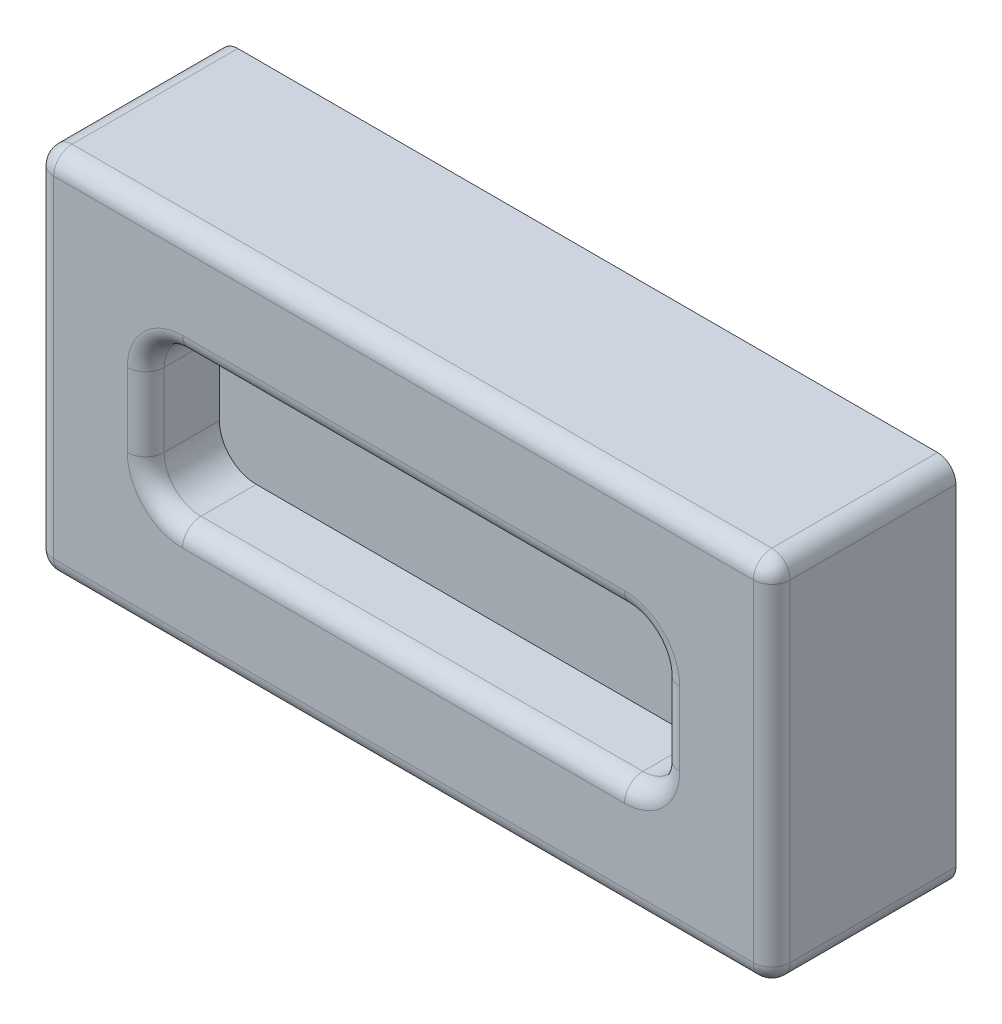
ISO-10303-21;
HEADER;
FILE_DESCRIPTION(('STEP AP214'),'2;1');
FILE_NAME('part.step','',(''),(''),'','','');
FILE_SCHEMA(('AUTOMOTIVE_DESIGN { 1 0 10303 214 1 1 1 1 }'));
ENDSEC;
DATA;
#1=APPLICATION_CONTEXT('core data for automotive mechanical design processes');
#2=APPLICATION_PROTOCOL_DEFINITION('international standard','automotive_design',2000,#1);
#3=PRODUCT_CONTEXT('',#1,'mechanical');
#4=PRODUCT('Part','Part','',(#3));
#5=PRODUCT_RELATED_PRODUCT_CATEGORY('part','',(#4));
#6=PRODUCT_DEFINITION_FORMATION('','',#4);
#7=PRODUCT_DEFINITION_CONTEXT('part definition',#1,'design');
#8=PRODUCT_DEFINITION('design','',#6,#7);
#9=PRODUCT_DEFINITION_SHAPE('','',#8);
#10=(LENGTH_UNIT() NAMED_UNIT(*) SI_UNIT(.MILLI.,.METRE.));
#11=(NAMED_UNIT(*) PLANE_ANGLE_UNIT() SI_UNIT($,.RADIAN.));
#12=(NAMED_UNIT(*) SI_UNIT($,.STERADIAN.) SOLID_ANGLE_UNIT());
#13=UNCERTAINTY_MEASURE_WITH_UNIT(LENGTH_MEASURE(1.E-05),#10,'distance_accuracy_value','');
#14=(GEOMETRIC_REPRESENTATION_CONTEXT(3) GLOBAL_UNCERTAINTY_ASSIGNED_CONTEXT((#13)) GLOBAL_UNIT_ASSIGNED_CONTEXT((#10,
#11,#12)) REPRESENTATION_CONTEXT('',''));
#15=CARTESIAN_POINT('',(0.,0.,0.));
#16=DIRECTION('',(0.,0.,1.));
#17=DIRECTION('',(1.,0.,0.));
#18=AXIS2_PLACEMENT_3D('',#15,#16,#17);
#19=CARTESIAN_POINT('',(0.,0.,5.));
#20=DIRECTION('',(1.,0.,0.));
#21=DIRECTION('',(0.,0.,-1.));
#22=AXIS2_PLACEMENT_3D('',#19,#20,#21);
#23=PLANE('',#22);
#24=DIRECTION('',(0.,-1.,0.));
#25=VECTOR('',#24,1.);
#26=CARTESIAN_POINT('',(0.,0.,0.));
#27=LINE('',#26,#25);
#28=CARTESIAN_POINT('',(0.,9.5,0.));
#29=VERTEX_POINT('',#28);
#30=CARTESIAN_POINT('',(0.,0.5,0.));
#31=VERTEX_POINT('',#30);
#32=EDGE_CURVE('E250',#29,#31,#27,.T.);
#33=ORIENTED_EDGE('',*,*,#32,.T.);
#34=DIRECTION('',(0.,0.,-1.));
#35=VECTOR('',#34,1.);
#36=CARTESIAN_POINT('',(0.,0.5,5.));
#37=LINE('',#36,#35);
#38=CARTESIAN_POINT('',(0.,0.5,4.5));
#39=VERTEX_POINT('',#38);
#40=EDGE_CURVE('E444',#31,#39,#37,.F.);
#41=ORIENTED_EDGE('',*,*,#40,.T.);
#42=DIRECTION('',(0.,-1.,0.));
#43=VECTOR('',#42,1.);
#44=CARTESIAN_POINT('',(0.,0.,4.5));
#45=LINE('',#44,#43);
#46=CARTESIAN_POINT('',(0.,9.5,4.5));
#47=VERTEX_POINT('',#46);
#48=EDGE_CURVE('E386',#39,#47,#45,.F.);
#49=ORIENTED_EDGE('',*,*,#48,.T.);
#50=DIRECTION('',(0.,0.,-1.));
#51=VECTOR('',#50,1.);
#52=CARTESIAN_POINT('',(0.,9.5,5.));
#53=LINE('',#52,#51);
#54=EDGE_CURVE('E418',#47,#29,#53,.T.);
#55=ORIENTED_EDGE('',*,*,#54,.T.);
#56=EDGE_LOOP('',(#33,#41,#49,#55));
#57=FACE_BOUND('',#56,.T.);
#58=ADVANCED_FACE('F41',(#57),#23,.F.);
#59=CARTESIAN_POINT('',(0.,0.,5.));
#60=DIRECTION('',(0.,1.,0.));
#61=DIRECTION('',(0.,0.,1.));
#62=AXIS2_PLACEMENT_3D('',#59,#60,#61);
#63=PLANE('',#62);
#64=DIRECTION('',(1.,0.,0.));
#65=VECTOR('',#64,1.);
#66=CARTESIAN_POINT('',(0.,0.,0.));
#67=LINE('',#66,#65);
#68=CARTESIAN_POINT('',(0.5,0.,0.));
#69=VERTEX_POINT('',#68);
#70=CARTESIAN_POINT('',(19.5,0.,0.));
#71=VERTEX_POINT('',#70);
#72=EDGE_CURVE('E276',#69,#71,#67,.T.);
#73=ORIENTED_EDGE('',*,*,#72,.T.);
#74=DIRECTION('',(0.,0.,-1.));
#75=VECTOR('',#74,1.);
#76=CARTESIAN_POINT('',(19.5,0.,5.));
#77=LINE('',#76,#75);
#78=CARTESIAN_POINT('',(19.5,0.,4.5));
#79=VERTEX_POINT('',#78);
#80=EDGE_CURVE('E11',#71,#79,#77,.F.);
#81=ORIENTED_EDGE('',*,*,#80,.T.);
#82=DIRECTION('',(1.,0.,0.));
#83=VECTOR('',#82,1.);
#84=CARTESIAN_POINT('',(0.,0.,4.5));
#85=LINE('',#84,#83);
#86=CARTESIAN_POINT('',(0.5,0.,4.5));
#87=VERTEX_POINT('',#86);
#88=EDGE_CURVE('E377',#79,#87,#85,.F.);
#89=ORIENTED_EDGE('',*,*,#88,.T.);
#90=DIRECTION('',(0.,0.,-1.));
#91=VECTOR('',#90,1.);
#92=CARTESIAN_POINT('',(0.5,0.,5.));
#93=LINE('',#92,#91);
#94=EDGE_CURVE('E438',#87,#69,#93,.T.);
#95=ORIENTED_EDGE('',*,*,#94,.T.);
#96=EDGE_LOOP('',(#73,#81,#89,#95));
#97=FACE_BOUND('',#96,.T.);
#98=ADVANCED_FACE('F481',(#97),#63,.F.);
#99=CARTESIAN_POINT('',(20.,0.,5.));
#100=DIRECTION('',(-1.,0.,0.));
#101=DIRECTION('',(0.,0.,1.));
#102=AXIS2_PLACEMENT_3D('',#99,#100,#101);
#103=PLANE('',#102);
#104=DIRECTION('',(0.,1.,0.));
#105=VECTOR('',#104,1.);
#106=CARTESIAN_POINT('',(20.,0.,4.5));
#107=LINE('',#106,#105);
#108=CARTESIAN_POINT('',(20.,9.5,4.5));
#109=VERTEX_POINT('',#108);
#110=CARTESIAN_POINT('',(20.,0.5,4.5));
#111=VERTEX_POINT('',#110);
#112=EDGE_CURVE('E380',#109,#111,#107,.F.);
#113=ORIENTED_EDGE('',*,*,#112,.T.);
#114=DIRECTION('',(0.,0.,-1.));
#115=VECTOR('',#114,1.);
#116=CARTESIAN_POINT('',(20.,0.5,5.));
#117=LINE('',#116,#115);
#118=CARTESIAN_POINT('',(20.,0.5,0.));
#119=VERTEX_POINT('',#118);
#120=EDGE_CURVE('E65',#111,#119,#117,.T.);
#121=ORIENTED_EDGE('',*,*,#120,.T.);
#122=DIRECTION('',(0.,1.,0.));
#123=VECTOR('',#122,1.);
#124=CARTESIAN_POINT('',(20.,0.,0.));
#125=LINE('',#124,#123);
#126=CARTESIAN_POINT('',(20.,9.5,0.));
#127=VERTEX_POINT('',#126);
#128=EDGE_CURVE('E279',#119,#127,#125,.T.);
#129=ORIENTED_EDGE('',*,*,#128,.T.);
#130=DIRECTION('',(0.,0.,-1.));
#131=VECTOR('',#130,1.);
#132=CARTESIAN_POINT('',(20.,9.5,5.));
#133=LINE('',#132,#131);
#134=EDGE_CURVE('E404',#127,#109,#133,.F.);
#135=ORIENTED_EDGE('',*,*,#134,.T.);
#136=EDGE_LOOP('',(#113,#121,#129,#135));
#137=FACE_BOUND('',#136,.T.);
#138=ADVANCED_FACE('F468',(#137),#103,.F.);
#139=CARTESIAN_POINT('',(0.,10.,5.));
#140=DIRECTION('',(0.,-1.,0.));
#141=DIRECTION('',(0.,0.,-1.));
#142=AXIS2_PLACEMENT_3D('',#139,#140,#141);
#143=PLANE('',#142);
#144=DIRECTION('',(-1.,0.,0.));
#145=VECTOR('',#144,1.);
#146=CARTESIAN_POINT('',(0.,10.,0.));
#147=LINE('',#146,#145);
#148=CARTESIAN_POINT('',(19.5,10.,0.));
#149=VERTEX_POINT('',#148);
#150=CARTESIAN_POINT('',(0.5,10.,0.));
#151=VERTEX_POINT('',#150);
#152=EDGE_CURVE('E282',#149,#151,#147,.T.);
#153=ORIENTED_EDGE('',*,*,#152,.T.);
#154=DIRECTION('',(0.,0.,-1.));
#155=VECTOR('',#154,1.);
#156=CARTESIAN_POINT('',(0.5,10.,5.));
#157=LINE('',#156,#155);
#158=CARTESIAN_POINT('',(0.5,10.,4.5));
#159=VERTEX_POINT('',#158);
#160=EDGE_CURVE('E424',#151,#159,#157,.F.);
#161=ORIENTED_EDGE('',*,*,#160,.T.);
#162=DIRECTION('',(-1.,0.,0.));
#163=VECTOR('',#162,1.);
#164=CARTESIAN_POINT('',(0.,10.,4.5));
#165=LINE('',#164,#163);
#166=CARTESIAN_POINT('',(19.5,10.,4.5));
#167=VERTEX_POINT('',#166);
#168=EDGE_CURVE('E383',#159,#167,#165,.F.);
#169=ORIENTED_EDGE('',*,*,#168,.T.);
#170=DIRECTION('',(0.,0.,-1.));
#171=VECTOR('',#170,1.);
#172=CARTESIAN_POINT('',(19.5,10.,5.));
#173=LINE('',#172,#171);
#174=EDGE_CURVE('E397',#167,#149,#173,.T.);
#175=ORIENTED_EDGE('',*,*,#174,.T.);
#176=EDGE_LOOP('',(#153,#161,#169,#175));
#177=FACE_BOUND('',#176,.T.);
#178=ADVANCED_FACE('F516',(#177),#143,.F.);
#179=CARTESIAN_POINT('',(0.,0.,5.));
#180=DIRECTION('',(0.,0.,-1.));
#181=DIRECTION('',(-1.,0.,0.));
#182=AXIS2_PLACEMENT_3D('',#179,#180,#181);
#183=PLANE('',#182);
#184=DIRECTION('',(0.,-1.,0.));
#185=VECTOR('',#184,1.);
#186=CARTESIAN_POINT('',(0.5,0.,5.));
#187=LINE('',#186,#185);
#188=CARTESIAN_POINT('',(0.5,9.5,5.));
#189=VERTEX_POINT('',#188);
#190=CARTESIAN_POINT('',(0.5,0.5,5.));
#191=VERTEX_POINT('',#190);
#192=EDGE_CURVE('E335',#189,#191,#187,.T.);
#193=ORIENTED_EDGE('',*,*,#192,.T.);
#194=DIRECTION('',(1.,0.,0.));
#195=VECTOR('',#194,1.);
#196=CARTESIAN_POINT('',(0.,0.5,5.));
#197=LINE('',#196,#195);
#198=CARTESIAN_POINT('',(19.5,0.5,5.));
#199=VERTEX_POINT('',#198);
#200=EDGE_CURVE('E373',#191,#199,#197,.T.);
#201=ORIENTED_EDGE('',*,*,#200,.T.);
#202=DIRECTION('',(0.,1.,0.));
#203=VECTOR('',#202,1.);
#204=CARTESIAN_POINT('',(19.5,0.,5.));
#205=LINE('',#204,#203);
#206=CARTESIAN_POINT('',(19.5,9.5,5.));
#207=VERTEX_POINT('',#206);
#208=EDGE_CURVE('E369',#199,#207,#205,.T.);
#209=ORIENTED_EDGE('',*,*,#208,.T.);
#210=DIRECTION('',(-1.,0.,0.));
#211=VECTOR('',#210,1.);
#212=CARTESIAN_POINT('',(0.,9.5,5.));
#213=LINE('',#212,#211);
#214=EDGE_CURVE('E365',#207,#189,#213,.T.);
#215=ORIENTED_EDGE('',*,*,#214,.T.);
#216=EDGE_LOOP('',(#193,#201,#209,#215));
#217=FACE_BOUND('',#216,.T.);
#218=DIRECTION('',(-1.,0.,0.));
#219=VECTOR('',#218,1.);
#220=CARTESIAN_POINT('',(0.,7.5,5.));
#221=LINE('',#220,#219);
#222=CARTESIAN_POINT('',(4.00000000000001,7.5,5.));
#223=VERTEX_POINT('',#222);
#224=CARTESIAN_POINT('',(16.,7.5,5.));
#225=VERTEX_POINT('',#224);
#226=EDGE_CURVE('E290',#223,#225,#221,.F.);
#227=ORIENTED_EDGE('',*,*,#226,.T.);
#228=CARTESIAN_POINT('',(16.,6.,5.));
#229=DIRECTION('',(0.,0.,-1.));
#230=DIRECTION('',(-1.,0.,0.));
#231=AXIS2_PLACEMENT_3D('',#228,#229,#230);
#232=CIRCLE('',#231,1.5);
#233=CARTESIAN_POINT('',(17.5,5.99999999999999,5.));
#234=VERTEX_POINT('',#233);
#235=EDGE_CURVE('E311',#225,#234,#232,.T.);
#236=ORIENTED_EDGE('',*,*,#235,.T.);
#237=DIRECTION('',(0.,1.,0.));
#238=VECTOR('',#237,1.);
#239=CARTESIAN_POINT('',(17.5,0.,5.));
#240=LINE('',#239,#238);
#241=CARTESIAN_POINT('',(17.5,4.00000000000001,5.));
#242=VERTEX_POINT('',#241);
#243=EDGE_CURVE('E308',#234,#242,#240,.F.);
#244=ORIENTED_EDGE('',*,*,#243,.T.);
#245=CARTESIAN_POINT('',(16.,4.,5.));
#246=DIRECTION('',(0.,0.,-1.));
#247=DIRECTION('',(-1.,0.,0.));
#248=AXIS2_PLACEMENT_3D('',#245,#246,#247);
#249=CIRCLE('',#248,1.5);
#250=CARTESIAN_POINT('',(16.,2.5,5.));
#251=VERTEX_POINT('',#250);
#252=EDGE_CURVE('E305',#242,#251,#249,.T.);
#253=ORIENTED_EDGE('',*,*,#252,.T.);
#254=DIRECTION('',(1.,0.,0.));
#255=VECTOR('',#254,1.);
#256=CARTESIAN_POINT('',(0.,2.5,5.));
#257=LINE('',#256,#255);
#258=CARTESIAN_POINT('',(4.00000000000001,2.5,5.));
#259=VERTEX_POINT('',#258);
#260=EDGE_CURVE('E302',#251,#259,#257,.F.);
#261=ORIENTED_EDGE('',*,*,#260,.T.);
#262=CARTESIAN_POINT('',(4.,4.,5.));
#263=DIRECTION('',(0.,0.,-1.));
#264=DIRECTION('',(-1.,0.,0.));
#265=AXIS2_PLACEMENT_3D('',#262,#263,#264);
#266=CIRCLE('',#265,1.5);
#267=CARTESIAN_POINT('',(2.5,4.00000000000001,5.));
#268=VERTEX_POINT('',#267);
#269=EDGE_CURVE('E299',#259,#268,#266,.T.);
#270=ORIENTED_EDGE('',*,*,#269,.T.);
#271=DIRECTION('',(0.,-1.,0.));
#272=VECTOR('',#271,1.);
#273=CARTESIAN_POINT('',(2.5,0.,5.));
#274=LINE('',#273,#272);
#275=CARTESIAN_POINT('',(2.5,5.99999999999999,5.));
#276=VERTEX_POINT('',#275);
#277=EDGE_CURVE('E296',#268,#276,#274,.F.);
#278=ORIENTED_EDGE('',*,*,#277,.T.);
#279=CARTESIAN_POINT('',(4.,6.,5.));
#280=DIRECTION('',(0.,0.,-1.));
#281=DIRECTION('',(-1.,0.,0.));
#282=AXIS2_PLACEMENT_3D('',#279,#280,#281);
#283=CIRCLE('',#282,1.5);
#284=EDGE_CURVE('E293',#276,#223,#283,.T.);
#285=ORIENTED_EDGE('',*,*,#284,.T.);
#286=EDGE_LOOP('',(#227,#236,#244,#253,#261,#270,#278,#285));
#287=FACE_BOUND('',#286,.T.);
#288=ADVANCED_FACE('F513',(#217,#287),#183,.F.);
#289=CARTESIAN_POINT('',(0.,0.,0.));
#290=DIRECTION('',(0.,0.,-1.));
#291=DIRECTION('',(-1.,0.,0.));
#292=AXIS2_PLACEMENT_3D('',#289,#290,#291);
#293=PLANE('',#292);
#294=ORIENTED_EDGE('',*,*,#128,.F.);
#295=CARTESIAN_POINT('',(19.5,0.5,0.));
#296=DIRECTION('',(0.,0.,-1.));
#297=DIRECTION('',(-1.,0.,0.));
#298=AXIS2_PLACEMENT_3D('',#295,#296,#297);
#299=CIRCLE('',#298,0.5);
#300=EDGE_CURVE('E51',#119,#71,#299,.T.);
#301=ORIENTED_EDGE('',*,*,#300,.T.);
#302=ORIENTED_EDGE('',*,*,#72,.F.);
#303=CARTESIAN_POINT('',(0.5,0.5,0.));
#304=DIRECTION('',(0.,0.,-1.));
#305=DIRECTION('',(-1.,0.,0.));
#306=AXIS2_PLACEMENT_3D('',#303,#304,#305);
#307=CIRCLE('',#306,0.5);
#308=EDGE_CURVE('E441',#69,#31,#307,.T.);
#309=ORIENTED_EDGE('',*,*,#308,.T.);
#310=ORIENTED_EDGE('',*,*,#32,.F.);
#311=CARTESIAN_POINT('',(0.5,9.5,0.));
#312=DIRECTION('',(0.,0.,-1.));
#313=DIRECTION('',(-1.,0.,0.));
#314=AXIS2_PLACEMENT_3D('',#311,#312,#313);
#315=CIRCLE('',#314,0.5);
#316=EDGE_CURVE('E421',#29,#151,#315,.T.);
#317=ORIENTED_EDGE('',*,*,#316,.T.);
#318=ORIENTED_EDGE('',*,*,#152,.F.);
#319=CARTESIAN_POINT('',(19.5,9.5,0.));
#320=DIRECTION('',(0.,0.,-1.));
#321=DIRECTION('',(-1.,0.,0.));
#322=AXIS2_PLACEMENT_3D('',#319,#320,#321);
#323=CIRCLE('',#322,0.5);
#324=EDGE_CURVE('E400',#149,#127,#323,.T.);
#325=ORIENTED_EDGE('',*,*,#324,.T.);
#326=EDGE_LOOP('',(#294,#301,#302,#309,#310,#317,#318,#325));
#327=FACE_BOUND('',#326,.T.);
#328=ADVANCED_FACE('F492',(#327),#293,.T.);
#329=CARTESIAN_POINT('',(4.,4.,3.));
#330=DIRECTION('',(0.,0.,1.));
#331=DIRECTION('',(1.,0.,0.));
#332=AXIS2_PLACEMENT_3D('',#329,#330,#331);
#333=CYLINDRICAL_SURFACE('',#332,1.);
#334=DIRECTION('',(0.,0.,1.));
#335=VECTOR('',#334,1.);
#336=CARTESIAN_POINT('',(3.,4.00000000000001,3.));
#337=LINE('',#336,#335);
#338=CARTESIAN_POINT('',(3.,4.00000000000001,3.));
#339=VERTEX_POINT('',#338);
#340=CARTESIAN_POINT('',(3.,4.00000000000001,4.5));
#341=VERTEX_POINT('',#340);
#342=EDGE_CURVE('E247',#339,#341,#337,.T.);
#343=ORIENTED_EDGE('',*,*,#342,.T.);
#344=CARTESIAN_POINT('',(4.,4.,4.5));
#345=DIRECTION('',(0.,0.,-1.));
#346=DIRECTION('',(-1.,0.,0.));
#347=AXIS2_PLACEMENT_3D('',#344,#345,#346);
#348=CIRCLE('',#347,1.);
#349=CARTESIAN_POINT('',(4.00000000000001,3.,4.5));
#350=VERTEX_POINT('',#349);
#351=EDGE_CURVE('E200',#341,#350,#348,.F.);
#352=ORIENTED_EDGE('',*,*,#351,.T.);
#353=DIRECTION('',(0.,0.,1.));
#354=VECTOR('',#353,1.);
#355=CARTESIAN_POINT('',(4.00000000000001,3.,3.));
#356=LINE('',#355,#354);
#357=CARTESIAN_POINT('',(4.00000000000001,3.,3.));
#358=VERTEX_POINT('',#357);
#359=EDGE_CURVE('E192',#358,#350,#356,.T.);
#360=ORIENTED_EDGE('',*,*,#359,.F.);
#361=CARTESIAN_POINT('',(4.,4.,3.));
#362=DIRECTION('',(0.,0.,1.));
#363=DIRECTION('',(1.,0.,0.));
#364=AXIS2_PLACEMENT_3D('',#361,#362,#363);
#365=CIRCLE('',#364,1.);
#366=EDGE_CURVE('E197',#339,#358,#365,.T.);
#367=ORIENTED_EDGE('',*,*,#366,.F.);
#368=EDGE_LOOP('',(#343,#352,#360,#367));
#369=FACE_BOUND('',#368,.T.);
#370=ADVANCED_FACE('F195',(#369),#333,.F.);
#371=CARTESIAN_POINT('',(3.,5.99999999999999,3.));
#372=DIRECTION('',(-1.,0.,0.));
#373=DIRECTION('',(0.,-1.,0.));
#374=AXIS2_PLACEMENT_3D('',#371,#372,#373);
#375=PLANE('',#374);
#376=DIRECTION('',(0.,0.,1.));
#377=VECTOR('',#376,1.);
#378=CARTESIAN_POINT('',(3.,5.99999999999999,3.));
#379=LINE('',#378,#377);
#380=CARTESIAN_POINT('',(3.,5.99999999999999,3.));
#381=VERTEX_POINT('',#380);
#382=CARTESIAN_POINT('',(3.,5.99999999999999,4.5));
#383=VERTEX_POINT('',#382);
#384=EDGE_CURVE('E251',#381,#383,#379,.T.);
#385=ORIENTED_EDGE('',*,*,#384,.T.);
#386=DIRECTION('',(0.,-1.,0.));
#387=VECTOR('',#386,1.);
#388=CARTESIAN_POINT('',(3.,5.99999999999999,4.5));
#389=LINE('',#388,#387);
#390=EDGE_CURVE('E326',#383,#341,#389,.T.);
#391=ORIENTED_EDGE('',*,*,#390,.T.);
#392=ORIENTED_EDGE('',*,*,#342,.F.);
#393=DIRECTION('',(0.,-1.,0.));
#394=VECTOR('',#393,1.);
#395=CARTESIAN_POINT('',(3.,5.99999999999999,3.));
#396=LINE('',#395,#394);
#397=EDGE_CURVE('E205',#381,#339,#396,.T.);
#398=ORIENTED_EDGE('',*,*,#397,.F.);
#399=EDGE_LOOP('',(#385,#391,#392,#398));
#400=FACE_BOUND('',#399,.T.);
#401=ADVANCED_FACE('F569',(#400),#375,.F.);
#402=CARTESIAN_POINT('',(4.,6.,3.));
#403=DIRECTION('',(0.,0.,1.));
#404=DIRECTION('',(1.,0.,0.));
#405=AXIS2_PLACEMENT_3D('',#402,#403,#404);
#406=CYLINDRICAL_SURFACE('',#405,1.);
#407=DIRECTION('',(0.,0.,1.));
#408=VECTOR('',#407,1.);
#409=CARTESIAN_POINT('',(4.00000000000001,7.,3.));
#410=LINE('',#409,#408);
#411=CARTESIAN_POINT('',(4.00000000000001,7.,3.));
#412=VERTEX_POINT('',#411);
#413=CARTESIAN_POINT('',(4.00000000000001,7.,4.5));
#414=VERTEX_POINT('',#413);
#415=EDGE_CURVE('E255',#412,#414,#410,.T.);
#416=ORIENTED_EDGE('',*,*,#415,.T.);
#417=CARTESIAN_POINT('',(4.,6.,4.5));
#418=DIRECTION('',(0.,0.,-1.));
#419=DIRECTION('',(-1.,0.,0.));
#420=AXIS2_PLACEMENT_3D('',#417,#418,#419);
#421=CIRCLE('',#420,1.);
#422=EDGE_CURVE('E329',#414,#383,#421,.F.);
#423=ORIENTED_EDGE('',*,*,#422,.T.);
#424=ORIENTED_EDGE('',*,*,#384,.F.);
#425=CARTESIAN_POINT('',(4.,6.,3.));
#426=DIRECTION('',(0.,0.,1.));
#427=DIRECTION('',(1.,0.,0.));
#428=AXIS2_PLACEMENT_3D('',#425,#426,#427);
#429=CIRCLE('',#428,1.);
#430=EDGE_CURVE('E242',#412,#381,#429,.T.);
#431=ORIENTED_EDGE('',*,*,#430,.F.);
#432=EDGE_LOOP('',(#416,#423,#424,#431));
#433=FACE_BOUND('',#432,.T.);
#434=ADVANCED_FACE('F567',(#433),#406,.F.);
#435=CARTESIAN_POINT('',(4.00000000000001,7.,3.));
#436=DIRECTION('',(0.,1.,0.));
#437=DIRECTION('',(0.,0.,1.));
#438=AXIS2_PLACEMENT_3D('',#435,#436,#437);
#439=PLANE('',#438);
#440=DIRECTION('',(0.,0.,1.));
#441=VECTOR('',#440,1.);
#442=CARTESIAN_POINT('',(16.,7.,3.));
#443=LINE('',#442,#441);
#444=CARTESIAN_POINT('',(16.,7.,3.));
#445=VERTEX_POINT('',#444);
#446=CARTESIAN_POINT('',(16.,7.,4.5));
#447=VERTEX_POINT('',#446);
#448=EDGE_CURVE('E259',#445,#447,#443,.T.);
#449=ORIENTED_EDGE('',*,*,#448,.T.);
#450=DIRECTION('',(-1.,0.,0.));
#451=VECTOR('',#450,1.);
#452=CARTESIAN_POINT('',(4.00000000000001,7.,4.5));
#453=LINE('',#452,#451);
#454=EDGE_CURVE('E332',#447,#414,#453,.T.);
#455=ORIENTED_EDGE('',*,*,#454,.T.);
#456=ORIENTED_EDGE('',*,*,#415,.F.);
#457=DIRECTION('',(-1.,0.,0.));
#458=VECTOR('',#457,1.);
#459=CARTESIAN_POINT('',(4.00000000000001,7.,3.));
#460=LINE('',#459,#458);
#461=EDGE_CURVE('E238',#445,#412,#460,.T.);
#462=ORIENTED_EDGE('',*,*,#461,.F.);
#463=EDGE_LOOP('',(#449,#455,#456,#462));
#464=FACE_BOUND('',#463,.T.);
#465=ADVANCED_FACE('F536',(#464),#439,.F.);
#466=CARTESIAN_POINT('',(16.,6.,3.));
#467=DIRECTION('',(0.,0.,1.));
#468=DIRECTION('',(1.,0.,0.));
#469=AXIS2_PLACEMENT_3D('',#466,#467,#468);
#470=CYLINDRICAL_SURFACE('',#469,1.);
#471=DIRECTION('',(0.,0.,1.));
#472=VECTOR('',#471,1.);
#473=CARTESIAN_POINT('',(17.,5.99999999999999,3.));
#474=LINE('',#473,#472);
#475=CARTESIAN_POINT('',(17.,5.99999999999999,3.));
#476=VERTEX_POINT('',#475);
#477=CARTESIAN_POINT('',(17.,5.99999999999999,4.5));
#478=VERTEX_POINT('',#477);
#479=EDGE_CURVE('E263',#476,#478,#474,.T.);
#480=ORIENTED_EDGE('',*,*,#479,.T.);
#481=CARTESIAN_POINT('',(16.,6.,4.5));
#482=DIRECTION('',(0.,0.,-1.));
#483=DIRECTION('',(-1.,0.,0.));
#484=AXIS2_PLACEMENT_3D('',#481,#482,#483);
#485=CIRCLE('',#484,1.);
#486=EDGE_CURVE('E286',#478,#447,#485,.F.);
#487=ORIENTED_EDGE('',*,*,#486,.T.);
#488=ORIENTED_EDGE('',*,*,#448,.F.);
#489=CARTESIAN_POINT('',(16.,6.,3.));
#490=DIRECTION('',(0.,0.,1.));
#491=DIRECTION('',(-1.,0.,0.));
#492=AXIS2_PLACEMENT_3D('',#489,#490,#491);
#493=CIRCLE('',#492,1.);
#494=EDGE_CURVE('E234',#476,#445,#493,.T.);
#495=ORIENTED_EDGE('',*,*,#494,.F.);
#496=EDGE_LOOP('',(#480,#487,#488,#495));
#497=FACE_BOUND('',#496,.T.);
#498=ADVANCED_FACE('F533',(#497),#470,.F.);
#499=CARTESIAN_POINT('',(17.,5.99999999999999,3.));
#500=DIRECTION('',(1.,0.,0.));
#501=DIRECTION('',(0.,0.,-1.));
#502=AXIS2_PLACEMENT_3D('',#499,#500,#501);
#503=PLANE('',#502);
#504=DIRECTION('',(0.,0.,1.));
#505=VECTOR('',#504,1.);
#506=CARTESIAN_POINT('',(17.,4.00000000000001,3.));
#507=LINE('',#506,#505);
#508=CARTESIAN_POINT('',(17.,4.00000000000001,3.));
#509=VERTEX_POINT('',#508);
#510=CARTESIAN_POINT('',(17.,4.00000000000001,4.5));
#511=VERTEX_POINT('',#510);
#512=EDGE_CURVE('E267',#509,#511,#507,.T.);
#513=ORIENTED_EDGE('',*,*,#512,.T.);
#514=DIRECTION('',(0.,1.,0.));
#515=VECTOR('',#514,1.);
#516=CARTESIAN_POINT('',(17.,5.99999999999999,4.5));
#517=LINE('',#516,#515);
#518=EDGE_CURVE('E315',#511,#478,#517,.T.);
#519=ORIENTED_EDGE('',*,*,#518,.T.);
#520=ORIENTED_EDGE('',*,*,#479,.F.);
#521=DIRECTION('',(0.,1.,0.));
#522=VECTOR('',#521,1.);
#523=CARTESIAN_POINT('',(17.,5.99999999999999,3.));
#524=LINE('',#523,#522);
#525=EDGE_CURVE('E230',#509,#476,#524,.T.);
#526=ORIENTED_EDGE('',*,*,#525,.F.);
#527=EDGE_LOOP('',(#513,#519,#520,#526));
#528=FACE_BOUND('',#527,.T.);
#529=ADVANCED_FACE('F540',(#528),#503,.F.);
#530=CARTESIAN_POINT('',(16.,4.,3.));
#531=DIRECTION('',(0.,0.,1.));
#532=DIRECTION('',(1.,0.,0.));
#533=AXIS2_PLACEMENT_3D('',#530,#531,#532);
#534=CYLINDRICAL_SURFACE('',#533,1.);
#535=DIRECTION('',(0.,0.,1.));
#536=VECTOR('',#535,1.);
#537=CARTESIAN_POINT('',(16.,3.,3.));
#538=LINE('',#537,#536);
#539=CARTESIAN_POINT('',(16.,3.,3.));
#540=VERTEX_POINT('',#539);
#541=CARTESIAN_POINT('',(16.,3.,4.5));
#542=VERTEX_POINT('',#541);
#543=EDGE_CURVE('E204',#540,#542,#538,.T.);
#544=ORIENTED_EDGE('',*,*,#543,.T.);
#545=CARTESIAN_POINT('',(16.,4.,4.5));
#546=DIRECTION('',(0.,0.,-1.));
#547=DIRECTION('',(-1.,0.,0.));
#548=AXIS2_PLACEMENT_3D('',#545,#546,#547);
#549=CIRCLE('',#548,1.);
#550=EDGE_CURVE('E318',#542,#511,#549,.F.);
#551=ORIENTED_EDGE('',*,*,#550,.T.);
#552=ORIENTED_EDGE('',*,*,#512,.F.);
#553=CARTESIAN_POINT('',(16.,4.,3.));
#554=DIRECTION('',(0.,0.,1.));
#555=DIRECTION('',(1.,0.,0.));
#556=AXIS2_PLACEMENT_3D('',#553,#554,#555);
#557=CIRCLE('',#556,1.);
#558=EDGE_CURVE('E215',#540,#509,#557,.T.);
#559=ORIENTED_EDGE('',*,*,#558,.F.);
#560=EDGE_LOOP('',(#544,#551,#552,#559));
#561=FACE_BOUND('',#560,.T.);
#562=ADVANCED_FACE('F719',(#561),#534,.F.);
#563=CARTESIAN_POINT('',(4.00000000000001,3.,3.));
#564=DIRECTION('',(0.,-1.,0.));
#565=DIRECTION('',(0.,0.,-1.));
#566=AXIS2_PLACEMENT_3D('',#563,#564,#565);
#567=PLANE('',#566);
#568=ORIENTED_EDGE('',*,*,#359,.T.);
#569=DIRECTION('',(1.,0.,0.));
#570=VECTOR('',#569,1.);
#571=CARTESIAN_POINT('',(4.00000000000001,3.,4.5));
#572=LINE('',#571,#570);
#573=EDGE_CURVE('E321',#350,#542,#572,.T.);
#574=ORIENTED_EDGE('',*,*,#573,.T.);
#575=ORIENTED_EDGE('',*,*,#543,.F.);
#576=DIRECTION('',(1.,0.,0.));
#577=VECTOR('',#576,1.);
#578=CARTESIAN_POINT('',(4.00000000000001,3.,3.));
#579=LINE('',#578,#577);
#580=EDGE_CURVE('E208',#358,#540,#579,.T.);
#581=ORIENTED_EDGE('',*,*,#580,.F.);
#582=EDGE_LOOP('',(#568,#574,#575,#581));
#583=FACE_BOUND('',#582,.T.);
#584=ADVANCED_FACE('F209',(#583),#567,.F.);
#585=CARTESIAN_POINT('',(4.,4.,3.));
#586=DIRECTION('',(0.,0.,1.));
#587=DIRECTION('',(1.,0.,0.));
#588=AXIS2_PLACEMENT_3D('',#585,#586,#587);
#589=PLANE('',#588);
#590=ORIENTED_EDGE('',*,*,#366,.T.);
#591=ORIENTED_EDGE('',*,*,#580,.T.);
#592=ORIENTED_EDGE('',*,*,#558,.T.);
#593=ORIENTED_EDGE('',*,*,#525,.T.);
#594=ORIENTED_EDGE('',*,*,#494,.T.);
#595=ORIENTED_EDGE('',*,*,#461,.T.);
#596=ORIENTED_EDGE('',*,*,#430,.T.);
#597=ORIENTED_EDGE('',*,*,#397,.T.);
#598=EDGE_LOOP('',(#590,#591,#592,#593,#594,#595,#596,#597));
#599=FACE_BOUND('',#598,.T.);
#600=ADVANCED_FACE('F217',(#599),#589,.T.);
#601=CARTESIAN_POINT('',(4.,4.,4.5));
#602=DIRECTION('',(0.,0.,-1.));
#603=DIRECTION('',(-1.,0.,0.));
#604=AXIS2_PLACEMENT_3D('',#601,#602,#603);
#605=TOROIDAL_SURFACE('',#604,1.5,0.5);
#606=CARTESIAN_POINT('',(2.5,4.00000000000001,4.5));
#607=DIRECTION('',(0.,1.,0.));
#608=DIRECTION('',(-1.,0.,0.));
#609=AXIS2_PLACEMENT_3D('',#606,#607,#608);
#610=CIRCLE('',#609,0.5);
#611=EDGE_CURVE('E225',#268,#341,#610,.T.);
#612=ORIENTED_EDGE('',*,*,#611,.F.);
#613=ORIENTED_EDGE('',*,*,#269,.F.);
#614=CARTESIAN_POINT('',(4.00000000000001,2.5,4.5));
#615=DIRECTION('',(1.,0.,0.));
#616=DIRECTION('',(0.,0.,-1.));
#617=AXIS2_PLACEMENT_3D('',#614,#615,#616);
#618=CIRCLE('',#617,0.5);
#619=EDGE_CURVE('E221',#350,#259,#618,.T.);
#620=ORIENTED_EDGE('',*,*,#619,.F.);
#621=ORIENTED_EDGE('',*,*,#351,.F.);
#622=EDGE_LOOP('',(#612,#613,#620,#621));
#623=FACE_BOUND('',#622,.T.);
#624=ADVANCED_FACE('F557',(#623),#605,.T.);
#625=CARTESIAN_POINT('',(4.00000000000001,2.5,4.5));
#626=DIRECTION('',(1.,0.,0.));
#627=DIRECTION('',(0.,0.,-1.));
#628=AXIS2_PLACEMENT_3D('',#625,#626,#627);
#629=CYLINDRICAL_SURFACE('',#628,0.5);
#630=ORIENTED_EDGE('',*,*,#619,.T.);
#631=ORIENTED_EDGE('',*,*,#260,.F.);
#632=CARTESIAN_POINT('',(16.,2.5,4.5));
#633=DIRECTION('',(1.,0.,0.));
#634=DIRECTION('',(0.,0.,-1.));
#635=AXIS2_PLACEMENT_3D('',#632,#633,#634);
#636=CIRCLE('',#635,0.5);
#637=EDGE_CURVE('E355',#542,#251,#636,.T.);
#638=ORIENTED_EDGE('',*,*,#637,.F.);
#639=ORIENTED_EDGE('',*,*,#573,.F.);
#640=EDGE_LOOP('',(#630,#631,#638,#639));
#641=FACE_BOUND('',#640,.T.);
#642=ADVANCED_FACE('F553',(#641),#629,.T.);
#643=CARTESIAN_POINT('',(2.5,5.99999999999999,4.5));
#644=DIRECTION('',(0.,-1.,0.));
#645=DIRECTION('',(1.,0.,0.));
#646=AXIS2_PLACEMENT_3D('',#643,#644,#645);
#647=CYLINDRICAL_SURFACE('',#646,0.5);
#648=ORIENTED_EDGE('',*,*,#611,.T.);
#649=ORIENTED_EDGE('',*,*,#390,.F.);
#650=CARTESIAN_POINT('',(2.5,5.99999999999999,4.5));
#651=DIRECTION('',(0.,1.,0.));
#652=DIRECTION('',(0.,0.,1.));
#653=AXIS2_PLACEMENT_3D('',#650,#651,#652);
#654=CIRCLE('',#653,0.5);
#655=EDGE_CURVE('E351',#276,#383,#654,.T.);
#656=ORIENTED_EDGE('',*,*,#655,.F.);
#657=ORIENTED_EDGE('',*,*,#277,.F.);
#658=EDGE_LOOP('',(#648,#649,#656,#657));
#659=FACE_BOUND('',#658,.T.);
#660=ADVANCED_FACE('F562',(#659),#647,.T.);
#661=CARTESIAN_POINT('',(16.,4.,4.5));
#662=DIRECTION('',(0.,0.,-1.));
#663=DIRECTION('',(-1.,0.,0.));
#664=AXIS2_PLACEMENT_3D('',#661,#662,#663);
#665=TOROIDAL_SURFACE('',#664,1.5,0.5);
#666=ORIENTED_EDGE('',*,*,#637,.T.);
#667=ORIENTED_EDGE('',*,*,#252,.F.);
#668=CARTESIAN_POINT('',(17.5,4.00000000000001,4.5));
#669=DIRECTION('',(0.,1.,0.));
#670=DIRECTION('',(0.,0.,1.));
#671=AXIS2_PLACEMENT_3D('',#668,#669,#670);
#672=CIRCLE('',#671,0.5);
#673=EDGE_CURVE('E347',#511,#242,#672,.T.);
#674=ORIENTED_EDGE('',*,*,#673,.F.);
#675=ORIENTED_EDGE('',*,*,#550,.F.);
#676=EDGE_LOOP('',(#666,#667,#674,#675));
#677=FACE_BOUND('',#676,.T.);
#678=ADVANCED_FACE('F548',(#677),#665,.T.);
#679=CARTESIAN_POINT('',(4.,6.,4.5));
#680=DIRECTION('',(0.,0.,-1.));
#681=DIRECTION('',(-1.,0.,0.));
#682=AXIS2_PLACEMENT_3D('',#679,#680,#681);
#683=TOROIDAL_SURFACE('',#682,1.5,0.5);
#684=ORIENTED_EDGE('',*,*,#655,.T.);
#685=ORIENTED_EDGE('',*,*,#422,.F.);
#686=CARTESIAN_POINT('',(4.00000000000001,7.5,4.5));
#687=DIRECTION('',(1.,0.,0.));
#688=DIRECTION('',(0.,1.,0.));
#689=AXIS2_PLACEMENT_3D('',#686,#687,#688);
#690=CIRCLE('',#689,0.5);
#691=EDGE_CURVE('E343',#223,#414,#690,.T.);
#692=ORIENTED_EDGE('',*,*,#691,.F.);
#693=ORIENTED_EDGE('',*,*,#284,.F.);
#694=EDGE_LOOP('',(#684,#685,#692,#693));
#695=FACE_BOUND('',#694,.T.);
#696=ADVANCED_FACE('F565',(#695),#683,.T.);
#697=CARTESIAN_POINT('',(17.5,5.99999999999999,4.5));
#698=DIRECTION('',(0.,1.,0.));
#699=DIRECTION('',(0.,0.,1.));
#700=AXIS2_PLACEMENT_3D('',#697,#698,#699);
#701=CYLINDRICAL_SURFACE('',#700,0.5);
#702=ORIENTED_EDGE('',*,*,#673,.T.);
#703=ORIENTED_EDGE('',*,*,#243,.F.);
#704=CARTESIAN_POINT('',(17.5,5.99999999999999,4.5));
#705=DIRECTION('',(0.,1.,0.));
#706=DIRECTION('',(0.,0.,1.));
#707=AXIS2_PLACEMENT_3D('',#704,#705,#706);
#708=CIRCLE('',#707,0.5);
#709=EDGE_CURVE('E339',#478,#234,#708,.T.);
#710=ORIENTED_EDGE('',*,*,#709,.F.);
#711=ORIENTED_EDGE('',*,*,#518,.F.);
#712=EDGE_LOOP('',(#702,#703,#710,#711));
#713=FACE_BOUND('',#712,.T.);
#714=ADVANCED_FACE('F544',(#713),#701,.T.);
#715=CARTESIAN_POINT('',(4.00000000000001,7.5,4.5));
#716=DIRECTION('',(-1.,0.,0.));
#717=DIRECTION('',(0.,0.,1.));
#718=AXIS2_PLACEMENT_3D('',#715,#716,#717);
#719=CYLINDRICAL_SURFACE('',#718,0.5);
#720=ORIENTED_EDGE('',*,*,#691,.T.);
#721=ORIENTED_EDGE('',*,*,#454,.F.);
#722=CARTESIAN_POINT('',(16.,7.5,4.5));
#723=DIRECTION('',(1.,0.,0.));
#724=DIRECTION('',(0.,1.,0.));
#725=AXIS2_PLACEMENT_3D('',#722,#723,#724);
#726=CIRCLE('',#725,0.5);
#727=EDGE_CURVE('E336',#225,#447,#726,.T.);
#728=ORIENTED_EDGE('',*,*,#727,.F.);
#729=ORIENTED_EDGE('',*,*,#226,.F.);
#730=EDGE_LOOP('',(#720,#721,#728,#729));
#731=FACE_BOUND('',#730,.T.);
#732=ADVANCED_FACE('F530',(#731),#719,.T.);
#733=CARTESIAN_POINT('',(16.,6.,4.5));
#734=DIRECTION('',(0.,0.,-1.));
#735=DIRECTION('',(-1.,0.,0.));
#736=AXIS2_PLACEMENT_3D('',#733,#734,#735);
#737=TOROIDAL_SURFACE('',#736,1.5,0.5);
#738=ORIENTED_EDGE('',*,*,#709,.T.);
#739=ORIENTED_EDGE('',*,*,#235,.F.);
#740=ORIENTED_EDGE('',*,*,#727,.T.);
#741=ORIENTED_EDGE('',*,*,#486,.F.);
#742=EDGE_LOOP('',(#738,#739,#740,#741));
#743=FACE_BOUND('',#742,.T.);
#744=ADVANCED_FACE('F525',(#743),#737,.T.);
#745=CARTESIAN_POINT('',(0.,9.5,4.5));
#746=DIRECTION('',(-1.,0.,0.));
#747=DIRECTION('',(0.,0.,1.));
#748=AXIS2_PLACEMENT_3D('',#745,#746,#747);
#749=CYLINDRICAL_SURFACE('',#748,0.5);
#750=ORIENTED_EDGE('',*,*,#168,.F.);
#751=CARTESIAN_POINT('',(0.5,9.5,4.5));
#752=DIRECTION('',(-1.,0.,0.));
#753=DIRECTION('',(0.,0.,1.));
#754=AXIS2_PLACEMENT_3D('',#751,#752,#753);
#755=CIRCLE('',#754,0.5);
#756=EDGE_CURVE('E415',#159,#189,#755,.F.);
#757=ORIENTED_EDGE('',*,*,#756,.T.);
#758=ORIENTED_EDGE('',*,*,#214,.F.);
#759=CARTESIAN_POINT('',(19.5,9.5,4.5));
#760=DIRECTION('',(-1.,0.,0.));
#761=DIRECTION('',(0.,0.,1.));
#762=AXIS2_PLACEMENT_3D('',#759,#760,#761);
#763=CIRCLE('',#762,0.5);
#764=EDGE_CURVE('E393',#207,#167,#763,.T.);
#765=ORIENTED_EDGE('',*,*,#764,.T.);
#766=EDGE_LOOP('',(#750,#757,#758,#765));
#767=FACE_BOUND('',#766,.T.);
#768=ADVANCED_FACE('F511',(#767),#749,.T.);
#769=CARTESIAN_POINT('',(0.5,0.,4.5));
#770=DIRECTION('',(0.,-1.,0.));
#771=DIRECTION('',(0.,0.,-1.));
#772=AXIS2_PLACEMENT_3D('',#769,#770,#771);
#773=CYLINDRICAL_SURFACE('',#772,0.5);
#774=ORIENTED_EDGE('',*,*,#48,.F.);
#775=CARTESIAN_POINT('',(0.5,0.5,4.5));
#776=DIRECTION('',(0.,-1.,0.));
#777=DIRECTION('',(0.,0.,-1.));
#778=AXIS2_PLACEMENT_3D('',#775,#776,#777);
#779=CIRCLE('',#778,0.5);
#780=EDGE_CURVE('E435',#39,#191,#779,.F.);
#781=ORIENTED_EDGE('',*,*,#780,.T.);
#782=ORIENTED_EDGE('',*,*,#192,.F.);
#783=CARTESIAN_POINT('',(0.5,9.5,4.5));
#784=DIRECTION('',(0.,-1.,0.));
#785=DIRECTION('',(0.,0.,-1.));
#786=AXIS2_PLACEMENT_3D('',#783,#784,#785);
#787=CIRCLE('',#786,0.5);
#788=EDGE_CURVE('E407',#189,#47,#787,.T.);
#789=ORIENTED_EDGE('',*,*,#788,.T.);
#790=EDGE_LOOP('',(#774,#781,#782,#789));
#791=FACE_BOUND('',#790,.T.);
#792=ADVANCED_FACE('F504',(#791),#773,.T.);
#793=CARTESIAN_POINT('',(19.5,0.,4.5));
#794=DIRECTION('',(0.,1.,0.));
#795=DIRECTION('',(0.,0.,1.));
#796=AXIS2_PLACEMENT_3D('',#793,#794,#795);
#797=CYLINDRICAL_SURFACE('',#796,0.5);
#798=ORIENTED_EDGE('',*,*,#208,.F.);
#799=CARTESIAN_POINT('',(19.5,0.5,4.5));
#800=DIRECTION('',(0.,1.,0.));
#801=DIRECTION('',(0.,0.,1.));
#802=AXIS2_PLACEMENT_3D('',#799,#800,#801);
#803=CIRCLE('',#802,0.5);
#804=EDGE_CURVE('E454',#199,#111,#803,.T.);
#805=ORIENTED_EDGE('',*,*,#804,.T.);
#806=ORIENTED_EDGE('',*,*,#112,.F.);
#807=CARTESIAN_POINT('',(19.5,9.5,4.5));
#808=DIRECTION('',(0.,1.,0.));
#809=DIRECTION('',(0.,0.,1.));
#810=AXIS2_PLACEMENT_3D('',#807,#808,#809);
#811=CIRCLE('',#810,0.5);
#812=EDGE_CURVE('E389',#109,#207,#811,.F.);
#813=ORIENTED_EDGE('',*,*,#812,.T.);
#814=EDGE_LOOP('',(#798,#805,#806,#813));
#815=FACE_BOUND('',#814,.T.);
#816=ADVANCED_FACE('F463',(#815),#797,.T.);
#817=CARTESIAN_POINT('',(0.,0.5,4.5));
#818=DIRECTION('',(1.,0.,0.));
#819=DIRECTION('',(0.,0.,-1.));
#820=AXIS2_PLACEMENT_3D('',#817,#818,#819);
#821=CYLINDRICAL_SURFACE('',#820,0.5);
#822=ORIENTED_EDGE('',*,*,#88,.F.);
#823=CARTESIAN_POINT('',(19.5,0.5,4.5));
#824=DIRECTION('',(1.,0.,0.));
#825=DIRECTION('',(0.,0.,-1.));
#826=AXIS2_PLACEMENT_3D('',#823,#824,#825);
#827=CIRCLE('',#826,0.5);
#828=EDGE_CURVE('E447',#79,#199,#827,.F.);
#829=ORIENTED_EDGE('',*,*,#828,.T.);
#830=ORIENTED_EDGE('',*,*,#200,.F.);
#831=CARTESIAN_POINT('',(0.5,0.5,4.5));
#832=DIRECTION('',(1.,0.,0.));
#833=DIRECTION('',(0.,0.,-1.));
#834=AXIS2_PLACEMENT_3D('',#831,#832,#833);
#835=CIRCLE('',#834,0.5);
#836=EDGE_CURVE('E427',#191,#87,#835,.T.);
#837=ORIENTED_EDGE('',*,*,#836,.T.);
#838=EDGE_LOOP('',(#822,#829,#830,#837));
#839=FACE_BOUND('',#838,.T.);
#840=ADVANCED_FACE('F478',(#839),#821,.T.);
#841=CARTESIAN_POINT('',(19.5,9.5,5.));
#842=DIRECTION('',(0.,0.,-1.));
#843=DIRECTION('',(-1.,0.,0.));
#844=AXIS2_PLACEMENT_3D('',#841,#842,#843);
#845=CYLINDRICAL_SURFACE('',#844,0.5);
#846=ORIENTED_EDGE('',*,*,#324,.F.);
#847=ORIENTED_EDGE('',*,*,#174,.F.);
#848=CARTESIAN_POINT('',(19.5,9.5,4.5));
#849=DIRECTION('',(0.,0.,1.));
#850=DIRECTION('',(1.,0.,0.));
#851=AXIS2_PLACEMENT_3D('',#848,#849,#850);
#852=CIRCLE('',#851,0.5);
#853=EDGE_CURVE('E340',#109,#167,#852,.T.);
#854=ORIENTED_EDGE('',*,*,#853,.F.);
#855=ORIENTED_EDGE('',*,*,#134,.F.);
#856=EDGE_LOOP('',(#846,#847,#854,#855));
#857=FACE_BOUND('',#856,.T.);
#858=ADVANCED_FACE('F605',(#857),#845,.T.);
#859=CARTESIAN_POINT('',(19.5,9.5,4.5));
#860=DIRECTION('',(0.,0.,1.));
#861=DIRECTION('',(1.,0.,0.));
#862=AXIS2_PLACEMENT_3D('',#859,#860,#861);
#863=SPHERICAL_SURFACE('',#862,0.5);
#864=ORIENTED_EDGE('',*,*,#853,.T.);
#865=ORIENTED_EDGE('',*,*,#764,.F.);
#866=ORIENTED_EDGE('',*,*,#812,.F.);
#867=EDGE_LOOP('',(#864,#865,#866));
#868=FACE_BOUND('',#867,.T.);
#869=ADVANCED_FACE('F612',(#868),#863,.T.);
#870=CARTESIAN_POINT('',(0.5,9.5,5.));
#871=DIRECTION('',(0.,0.,-1.));
#872=DIRECTION('',(-1.,0.,0.));
#873=AXIS2_PLACEMENT_3D('',#870,#871,#872);
#874=CYLINDRICAL_SURFACE('',#873,0.5);
#875=ORIENTED_EDGE('',*,*,#316,.F.);
#876=ORIENTED_EDGE('',*,*,#54,.F.);
#877=CARTESIAN_POINT('',(0.5,9.5,4.5));
#878=DIRECTION('',(0.,0.,1.));
#879=DIRECTION('',(1.,0.,0.));
#880=AXIS2_PLACEMENT_3D('',#877,#878,#879);
#881=CIRCLE('',#880,0.5);
#882=EDGE_CURVE('E411',#159,#47,#881,.T.);
#883=ORIENTED_EDGE('',*,*,#882,.F.);
#884=ORIENTED_EDGE('',*,*,#160,.F.);
#885=EDGE_LOOP('',(#875,#876,#883,#884));
#886=FACE_BOUND('',#885,.T.);
#887=ADVANCED_FACE('F499',(#886),#874,.T.);
#888=CARTESIAN_POINT('',(0.5,9.5,4.5));
#889=DIRECTION('',(0.,0.,1.));
#890=DIRECTION('',(1.,0.,0.));
#891=AXIS2_PLACEMENT_3D('',#888,#889,#890);
#892=SPHERICAL_SURFACE('',#891,0.5);
#893=ORIENTED_EDGE('',*,*,#788,.F.);
#894=ORIENTED_EDGE('',*,*,#756,.F.);
#895=ORIENTED_EDGE('',*,*,#882,.T.);
#896=EDGE_LOOP('',(#893,#894,#895));
#897=FACE_BOUND('',#896,.T.);
#898=ADVANCED_FACE('F507',(#897),#892,.T.);
#899=CARTESIAN_POINT('',(0.5,0.5,5.));
#900=DIRECTION('',(0.,0.,-1.));
#901=DIRECTION('',(-1.,0.,0.));
#902=AXIS2_PLACEMENT_3D('',#899,#900,#901);
#903=CYLINDRICAL_SURFACE('',#902,0.5);
#904=ORIENTED_EDGE('',*,*,#308,.F.);
#905=ORIENTED_EDGE('',*,*,#94,.F.);
#906=CARTESIAN_POINT('',(0.5,0.5,4.5));
#907=DIRECTION('',(0.,0.,1.));
#908=DIRECTION('',(1.,0.,0.));
#909=AXIS2_PLACEMENT_3D('',#906,#907,#908);
#910=CIRCLE('',#909,0.5);
#911=EDGE_CURVE('E431',#39,#87,#910,.T.);
#912=ORIENTED_EDGE('',*,*,#911,.F.);
#913=ORIENTED_EDGE('',*,*,#40,.F.);
#914=EDGE_LOOP('',(#904,#905,#912,#913));
#915=FACE_BOUND('',#914,.T.);
#916=ADVANCED_FACE('F490',(#915),#903,.T.);
#917=CARTESIAN_POINT('',(0.5,0.5,4.5));
#918=DIRECTION('',(0.,0.,1.));
#919=DIRECTION('',(1.,0.,0.));
#920=AXIS2_PLACEMENT_3D('',#917,#918,#919);
#921=SPHERICAL_SURFACE('',#920,0.5);
#922=ORIENTED_EDGE('',*,*,#836,.F.);
#923=ORIENTED_EDGE('',*,*,#780,.F.);
#924=ORIENTED_EDGE('',*,*,#911,.T.);
#925=EDGE_LOOP('',(#922,#923,#924));
#926=FACE_BOUND('',#925,.T.);
#927=ADVANCED_FACE('F486',(#926),#921,.T.);
#928=CARTESIAN_POINT('',(19.5,0.5,5.));
#929=DIRECTION('',(0.,0.,-1.));
#930=DIRECTION('',(-1.,0.,0.));
#931=AXIS2_PLACEMENT_3D('',#928,#929,#930);
#932=CYLINDRICAL_SURFACE('',#931,0.5);
#933=ORIENTED_EDGE('',*,*,#300,.F.);
#934=ORIENTED_EDGE('',*,*,#120,.F.);
#935=CARTESIAN_POINT('',(19.5,0.5,4.5));
#936=DIRECTION('',(0.,0.,1.));
#937=DIRECTION('',(1.,0.,0.));
#938=AXIS2_PLACEMENT_3D('',#935,#936,#937);
#939=CIRCLE('',#938,0.5);
#940=EDGE_CURVE('E45',#79,#111,#939,.T.);
#941=ORIENTED_EDGE('',*,*,#940,.F.);
#942=ORIENTED_EDGE('',*,*,#80,.F.);
#943=EDGE_LOOP('',(#933,#934,#941,#942));
#944=FACE_BOUND('',#943,.T.);
#945=ADVANCED_FACE('F43',(#944),#932,.T.);
#946=CARTESIAN_POINT('',(19.5,0.5,4.5));
#947=DIRECTION('',(0.,0.,1.));
#948=DIRECTION('',(1.,0.,0.));
#949=AXIS2_PLACEMENT_3D('',#946,#947,#948);
#950=SPHERICAL_SURFACE('',#949,0.5);
#951=ORIENTED_EDGE('',*,*,#940,.T.);
#952=ORIENTED_EDGE('',*,*,#804,.F.);
#953=ORIENTED_EDGE('',*,*,#828,.F.);
#954=EDGE_LOOP('',(#951,#952,#953));
#955=FACE_BOUND('',#954,.T.);
#956=ADVANCED_FACE('F473',(#955),#950,.T.);
#957=CLOSED_SHELL('',(#58,#98,#138,#178,#288,#328,#370,#401,#434,#465,#498,#529,#562,#584,#600,
#624,#642,#660,#678,#696,#714,#732,#744,#768,#792,#816,#840,#858,#869,#887,#898,#916,#927,#945,#956));
#958=MANIFOLD_SOLID_BREP('B2',#957);
#959=ADVANCED_BREP_SHAPE_REPRESENTATION('',(#18,#958),#14);
#960=SHAPE_DEFINITION_REPRESENTATION(#9,#959);
ENDSEC;
END-ISO-10303-21;
